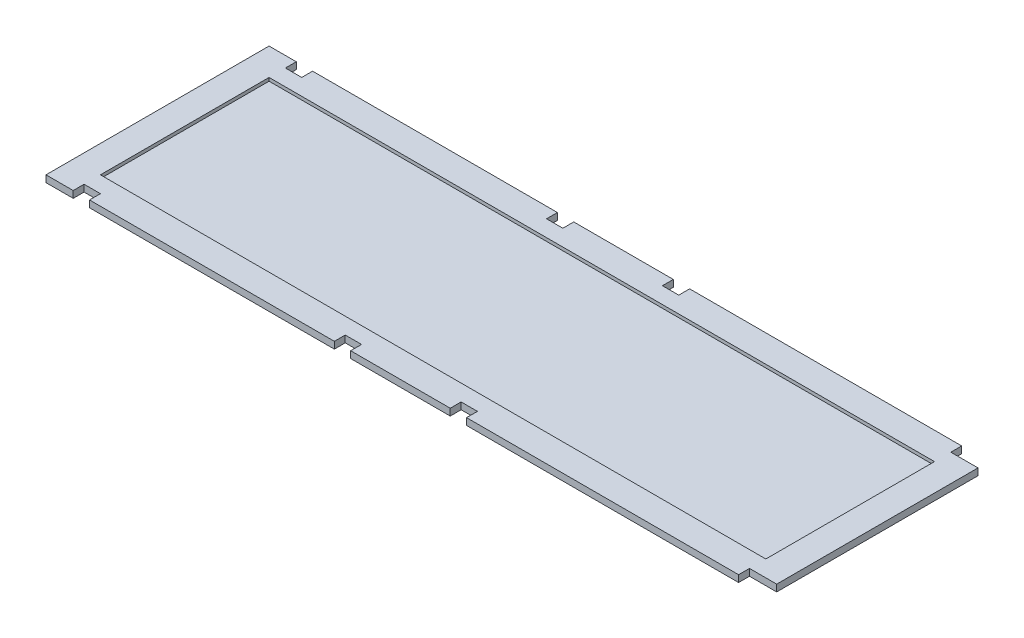
ISO-10303-21;
HEADER;
FILE_DESCRIPTION(('STEP AP214'),'2;1');
FILE_NAME('part.step','',(''),(''),'','','');
FILE_SCHEMA(('AUTOMOTIVE_DESIGN { 1 0 10303 214 1 1 1 1 }'));
ENDSEC;
DATA;
#1=APPLICATION_CONTEXT('core data for automotive mechanical design processes');
#2=APPLICATION_PROTOCOL_DEFINITION('international standard','automotive_design',2000,#1);
#3=PRODUCT_CONTEXT('',#1,'mechanical');
#4=PRODUCT('Part','Part','',(#3));
#5=PRODUCT_RELATED_PRODUCT_CATEGORY('part','',(#4));
#6=PRODUCT_DEFINITION_FORMATION('','',#4);
#7=PRODUCT_DEFINITION_CONTEXT('part definition',#1,'design');
#8=PRODUCT_DEFINITION('design','',#6,#7);
#9=PRODUCT_DEFINITION_SHAPE('','',#8);
#10=(LENGTH_UNIT() NAMED_UNIT(*) SI_UNIT(.MILLI.,.METRE.));
#11=(NAMED_UNIT(*) PLANE_ANGLE_UNIT() SI_UNIT($,.RADIAN.));
#12=(NAMED_UNIT(*) SI_UNIT($,.STERADIAN.) SOLID_ANGLE_UNIT());
#13=UNCERTAINTY_MEASURE_WITH_UNIT(LENGTH_MEASURE(1.E-05),#10,'distance_accuracy_value','');
#14=(GEOMETRIC_REPRESENTATION_CONTEXT(3) GLOBAL_UNCERTAINTY_ASSIGNED_CONTEXT((#13)) GLOBAL_UNIT_ASSIGNED_CONTEXT((#10,
#11,#12)) REPRESENTATION_CONTEXT('',''));
#15=CARTESIAN_POINT('',(0.,0.,0.));
#16=DIRECTION('',(0.,0.,1.));
#17=DIRECTION('',(1.,0.,0.));
#18=AXIS2_PLACEMENT_3D('',#15,#16,#17);
#19=CARTESIAN_POINT('',(0.,1.25,0.));
#20=DIRECTION('',(1.,0.,0.));
#21=DIRECTION('',(0.,0.,-1.));
#22=AXIS2_PLACEMENT_3D('',#19,#20,#21);
#23=PLANE('',#22);
#24=DIRECTION('',(0.,0.,1.));
#25=VECTOR('',#24,1.);
#26=CARTESIAN_POINT('',(0.,0.,0.));
#27=LINE('',#26,#25);
#28=CARTESIAN_POINT('',(0.,0.,-41.));
#29=VERTEX_POINT('',#28);
#30=CARTESIAN_POINT('',(0.,0.,0.));
#31=VERTEX_POINT('',#30);
#32=EDGE_CURVE('E285',#29,#31,#27,.T.);
#33=ORIENTED_EDGE('',*,*,#32,.T.);
#34=DIRECTION('',(0.,-1.,0.));
#35=VECTOR('',#34,1.);
#36=CARTESIAN_POINT('',(0.,1.25,0.));
#37=LINE('',#36,#35);
#38=CARTESIAN_POINT('',(0.,1.25,0.));
#39=VERTEX_POINT('',#38);
#40=EDGE_CURVE('E11',#39,#31,#37,.T.);
#41=ORIENTED_EDGE('',*,*,#40,.F.);
#42=DIRECTION('',(0.,0.,1.));
#43=VECTOR('',#42,1.);
#44=CARTESIAN_POINT('',(0.,1.25,0.));
#45=LINE('',#44,#43);
#46=CARTESIAN_POINT('',(0.,1.25,-41.));
#47=VERTEX_POINT('',#46);
#48=EDGE_CURVE('E349',#47,#39,#45,.T.);
#49=ORIENTED_EDGE('',*,*,#48,.F.);
#50=DIRECTION('',(0.,-1.,0.));
#51=VECTOR('',#50,1.);
#52=CARTESIAN_POINT('',(0.,1.25,-41.));
#53=LINE('',#52,#51);
#54=EDGE_CURVE('E281',#47,#29,#53,.T.);
#55=ORIENTED_EDGE('',*,*,#54,.T.);
#56=EDGE_LOOP('',(#33,#41,#49,#55));
#57=FACE_BOUND('',#56,.T.);
#58=ADVANCED_FACE('F33',(#57),#23,.F.);
#59=CARTESIAN_POINT('',(0.,1.25,0.));
#60=DIRECTION('',(0.,0.,-1.));
#61=DIRECTION('',(-1.,0.,0.));
#62=AXIS2_PLACEMENT_3D('',#59,#60,#61);
#63=PLANE('',#62);
#64=DIRECTION('',(1.,0.,0.));
#65=VECTOR('',#64,1.);
#66=CARTESIAN_POINT('',(0.,0.,0.));
#67=LINE('',#66,#65);
#68=CARTESIAN_POINT('',(5.,0.,0.));
#69=VERTEX_POINT('',#68);
#70=EDGE_CURVE('E288',#31,#69,#67,.T.);
#71=ORIENTED_EDGE('',*,*,#70,.T.);
#72=DIRECTION('',(0.,-1.,0.));
#73=VECTOR('',#72,1.);
#74=CARTESIAN_POINT('',(5.,1.25,0.));
#75=LINE('',#74,#73);
#76=CARTESIAN_POINT('',(5.,1.25,0.));
#77=VERTEX_POINT('',#76);
#78=EDGE_CURVE('E40',#77,#69,#75,.T.);
#79=ORIENTED_EDGE('',*,*,#78,.F.);
#80=DIRECTION('',(1.,0.,0.));
#81=VECTOR('',#80,1.);
#82=CARTESIAN_POINT('',(0.,1.25,0.));
#83=LINE('',#82,#81);
#84=EDGE_CURVE('E169',#39,#77,#83,.T.);
#85=ORIENTED_EDGE('',*,*,#84,.F.);
#86=ORIENTED_EDGE('',*,*,#40,.T.);
#87=EDGE_LOOP('',(#71,#79,#85,#86));
#88=FACE_BOUND('',#87,.T.);
#89=ADVANCED_FACE('F590',(#88),#63,.F.);
#90=CARTESIAN_POINT('',(5.,1.25,0.));
#91=DIRECTION('',(-1.,0.,0.));
#92=DIRECTION('',(0.,0.,1.));
#93=AXIS2_PLACEMENT_3D('',#90,#91,#92);
#94=PLANE('',#93);
#95=DIRECTION('',(0.,0.,-1.));
#96=VECTOR('',#95,1.);
#97=CARTESIAN_POINT('',(5.,0.,0.));
#98=LINE('',#97,#96);
#99=CARTESIAN_POINT('',(5.,0.,-2.));
#100=VERTEX_POINT('',#99);
#101=EDGE_CURVE('E291',#69,#100,#98,.T.);
#102=ORIENTED_EDGE('',*,*,#101,.T.);
#103=DIRECTION('',(0.,-1.,0.));
#104=VECTOR('',#103,1.);
#105=CARTESIAN_POINT('',(5.,1.25,-2.));
#106=LINE('',#105,#104);
#107=CARTESIAN_POINT('',(5.,1.25,-2.));
#108=VERTEX_POINT('',#107);
#109=EDGE_CURVE('E428',#108,#100,#106,.T.);
#110=ORIENTED_EDGE('',*,*,#109,.F.);
#111=DIRECTION('',(0.,0.,-1.));
#112=VECTOR('',#111,1.);
#113=CARTESIAN_POINT('',(5.,1.25,0.));
#114=LINE('',#113,#112);
#115=EDGE_CURVE('E436',#77,#108,#114,.T.);
#116=ORIENTED_EDGE('',*,*,#115,.F.);
#117=ORIENTED_EDGE('',*,*,#78,.T.);
#118=EDGE_LOOP('',(#102,#110,#116,#117));
#119=FACE_BOUND('',#118,.T.);
#120=ADVANCED_FACE('F434',(#119),#94,.F.);
#121=CARTESIAN_POINT('',(5.,1.25,-2.));
#122=DIRECTION('',(0.,0.,-1.));
#123=DIRECTION('',(-1.,0.,0.));
#124=AXIS2_PLACEMENT_3D('',#121,#122,#123);
#125=PLANE('',#124);
#126=DIRECTION('',(1.,0.,0.));
#127=VECTOR('',#126,1.);
#128=CARTESIAN_POINT('',(5.,0.,-2.));
#129=LINE('',#128,#127);
#130=CARTESIAN_POINT('',(8.,0.,-2.));
#131=VERTEX_POINT('',#130);
#132=EDGE_CURVE('E293',#100,#131,#129,.T.);
#133=ORIENTED_EDGE('',*,*,#132,.T.);
#134=DIRECTION('',(0.,-1.,0.));
#135=VECTOR('',#134,1.);
#136=CARTESIAN_POINT('',(8.,1.25,-2.));
#137=LINE('',#136,#135);
#138=CARTESIAN_POINT('',(8.,1.25,-2.));
#139=VERTEX_POINT('',#138);
#140=EDGE_CURVE('E425',#139,#131,#137,.T.);
#141=ORIENTED_EDGE('',*,*,#140,.F.);
#142=DIRECTION('',(1.,0.,0.));
#143=VECTOR('',#142,1.);
#144=CARTESIAN_POINT('',(5.,1.25,-2.));
#145=LINE('',#144,#143);
#146=EDGE_CURVE('E454',#108,#139,#145,.T.);
#147=ORIENTED_EDGE('',*,*,#146,.F.);
#148=ORIENTED_EDGE('',*,*,#109,.T.);
#149=EDGE_LOOP('',(#133,#141,#147,#148));
#150=FACE_BOUND('',#149,.T.);
#151=ADVANCED_FACE('F445',(#150),#125,.F.);
#152=CARTESIAN_POINT('',(8.,1.25,0.));
#153=DIRECTION('',(1.,0.,0.));
#154=DIRECTION('',(0.,0.,-1.));
#155=AXIS2_PLACEMENT_3D('',#152,#153,#154);
#156=PLANE('',#155);
#157=DIRECTION('',(0.,0.,1.));
#158=VECTOR('',#157,1.);
#159=CARTESIAN_POINT('',(8.,0.,0.));
#160=LINE('',#159,#158);
#161=CARTESIAN_POINT('',(8.,0.,0.));
#162=VERTEX_POINT('',#161);
#163=EDGE_CURVE('E295',#131,#162,#160,.T.);
#164=ORIENTED_EDGE('',*,*,#163,.T.);
#165=DIRECTION('',(0.,-1.,0.));
#166=VECTOR('',#165,1.);
#167=CARTESIAN_POINT('',(8.,1.25,0.));
#168=LINE('',#167,#166);
#169=CARTESIAN_POINT('',(8.,1.25,0.));
#170=VERTEX_POINT('',#169);
#171=EDGE_CURVE('E422',#170,#162,#168,.T.);
#172=ORIENTED_EDGE('',*,*,#171,.F.);
#173=DIRECTION('',(0.,0.,1.));
#174=VECTOR('',#173,1.);
#175=CARTESIAN_POINT('',(8.,1.25,0.));
#176=LINE('',#175,#174);
#177=EDGE_CURVE('E451',#139,#170,#176,.T.);
#178=ORIENTED_EDGE('',*,*,#177,.F.);
#179=ORIENTED_EDGE('',*,*,#140,.T.);
#180=EDGE_LOOP('',(#164,#172,#178,#179));
#181=FACE_BOUND('',#180,.T.);
#182=ADVANCED_FACE('F449',(#181),#156,.F.);
#183=CARTESIAN_POINT('',(8.,1.25,0.));
#184=DIRECTION('',(0.,0.,-1.));
#185=DIRECTION('',(-1.,0.,0.));
#186=AXIS2_PLACEMENT_3D('',#183,#184,#185);
#187=PLANE('',#186);
#188=DIRECTION('',(1.,0.,0.));
#189=VECTOR('',#188,1.);
#190=CARTESIAN_POINT('',(8.,0.,0.));
#191=LINE('',#190,#189);
#192=CARTESIAN_POINT('',(53.,0.,0.));
#193=VERTEX_POINT('',#192);
#194=EDGE_CURVE('E297',#162,#193,#191,.T.);
#195=ORIENTED_EDGE('',*,*,#194,.T.);
#196=DIRECTION('',(0.,-1.,0.));
#197=VECTOR('',#196,1.);
#198=CARTESIAN_POINT('',(53.,1.25,0.));
#199=LINE('',#198,#197);
#200=CARTESIAN_POINT('',(53.,1.25,0.));
#201=VERTEX_POINT('',#200);
#202=EDGE_CURVE('E419',#201,#193,#199,.T.);
#203=ORIENTED_EDGE('',*,*,#202,.F.);
#204=DIRECTION('',(1.,0.,0.));
#205=VECTOR('',#204,1.);
#206=CARTESIAN_POINT('',(8.,1.25,0.));
#207=LINE('',#206,#205);
#208=EDGE_CURVE('E453',#170,#201,#207,.T.);
#209=ORIENTED_EDGE('',*,*,#208,.F.);
#210=ORIENTED_EDGE('',*,*,#171,.T.);
#211=EDGE_LOOP('',(#195,#203,#209,#210));
#212=FACE_BOUND('',#211,.T.);
#213=ADVANCED_FACE('F603',(#212),#187,.F.);
#214=CARTESIAN_POINT('',(53.,1.25,0.));
#215=DIRECTION('',(-1.,0.,0.));
#216=DIRECTION('',(0.,0.,1.));
#217=AXIS2_PLACEMENT_3D('',#214,#215,#216);
#218=PLANE('',#217);
#219=DIRECTION('',(0.,0.,-1.));
#220=VECTOR('',#219,1.);
#221=CARTESIAN_POINT('',(53.,0.,0.));
#222=LINE('',#221,#220);
#223=CARTESIAN_POINT('',(53.,0.,-2.));
#224=VERTEX_POINT('',#223);
#225=EDGE_CURVE('E299',#193,#224,#222,.T.);
#226=ORIENTED_EDGE('',*,*,#225,.T.);
#227=DIRECTION('',(0.,-1.,0.));
#228=VECTOR('',#227,1.);
#229=CARTESIAN_POINT('',(53.,1.25,-2.));
#230=LINE('',#229,#228);
#231=CARTESIAN_POINT('',(53.,1.25,-2.));
#232=VERTEX_POINT('',#231);
#233=EDGE_CURVE('E416',#232,#224,#230,.T.);
#234=ORIENTED_EDGE('',*,*,#233,.F.);
#235=DIRECTION('',(0.,0.,-1.));
#236=VECTOR('',#235,1.);
#237=CARTESIAN_POINT('',(53.,1.25,0.));
#238=LINE('',#237,#236);
#239=EDGE_CURVE('E456',#201,#232,#238,.T.);
#240=ORIENTED_EDGE('',*,*,#239,.F.);
#241=ORIENTED_EDGE('',*,*,#202,.T.);
#242=EDGE_LOOP('',(#226,#234,#240,#241));
#243=FACE_BOUND('',#242,.T.);
#244=ADVANCED_FACE('F606',(#243),#218,.F.);
#245=CARTESIAN_POINT('',(53.,1.25,-2.));
#246=DIRECTION('',(0.,0.,-1.));
#247=DIRECTION('',(-1.,0.,0.));
#248=AXIS2_PLACEMENT_3D('',#245,#246,#247);
#249=PLANE('',#248);
#250=DIRECTION('',(1.,0.,0.));
#251=VECTOR('',#250,1.);
#252=CARTESIAN_POINT('',(53.,0.,-2.));
#253=LINE('',#252,#251);
#254=CARTESIAN_POINT('',(56.,0.,-2.));
#255=VERTEX_POINT('',#254);
#256=EDGE_CURVE('E301',#224,#255,#253,.T.);
#257=ORIENTED_EDGE('',*,*,#256,.T.);
#258=DIRECTION('',(0.,-1.,0.));
#259=VECTOR('',#258,1.);
#260=CARTESIAN_POINT('',(56.,1.25,-2.));
#261=LINE('',#260,#259);
#262=CARTESIAN_POINT('',(56.,1.25,-2.));
#263=VERTEX_POINT('',#262);
#264=EDGE_CURVE('E413',#263,#255,#261,.T.);
#265=ORIENTED_EDGE('',*,*,#264,.F.);
#266=DIRECTION('',(1.,0.,0.));
#267=VECTOR('',#266,1.);
#268=CARTESIAN_POINT('',(53.,1.25,-2.));
#269=LINE('',#268,#267);
#270=EDGE_CURVE('E462',#232,#263,#269,.T.);
#271=ORIENTED_EDGE('',*,*,#270,.F.);
#272=ORIENTED_EDGE('',*,*,#233,.T.);
#273=EDGE_LOOP('',(#257,#265,#271,#272));
#274=FACE_BOUND('',#273,.T.);
#275=ADVANCED_FACE('F610',(#274),#249,.F.);
#276=CARTESIAN_POINT('',(56.,1.25,0.));
#277=DIRECTION('',(1.,0.,0.));
#278=DIRECTION('',(0.,0.,-1.));
#279=AXIS2_PLACEMENT_3D('',#276,#277,#278);
#280=PLANE('',#279);
#281=DIRECTION('',(0.,0.,1.));
#282=VECTOR('',#281,1.);
#283=CARTESIAN_POINT('',(56.,0.,0.));
#284=LINE('',#283,#282);
#285=CARTESIAN_POINT('',(56.,0.,0.));
#286=VERTEX_POINT('',#285);
#287=EDGE_CURVE('E303',#255,#286,#284,.T.);
#288=ORIENTED_EDGE('',*,*,#287,.T.);
#289=DIRECTION('',(0.,-1.,0.));
#290=VECTOR('',#289,1.);
#291=CARTESIAN_POINT('',(56.,1.25,0.));
#292=LINE('',#291,#290);
#293=CARTESIAN_POINT('',(56.,1.25,0.));
#294=VERTEX_POINT('',#293);
#295=EDGE_CURVE('E410',#294,#286,#292,.T.);
#296=ORIENTED_EDGE('',*,*,#295,.F.);
#297=DIRECTION('',(0.,0.,1.));
#298=VECTOR('',#297,1.);
#299=CARTESIAN_POINT('',(56.,1.25,0.));
#300=LINE('',#299,#298);
#301=EDGE_CURVE('E464',#263,#294,#300,.T.);
#302=ORIENTED_EDGE('',*,*,#301,.F.);
#303=ORIENTED_EDGE('',*,*,#264,.T.);
#304=EDGE_LOOP('',(#288,#296,#302,#303));
#305=FACE_BOUND('',#304,.T.);
#306=ADVANCED_FACE('F614',(#305),#280,.F.);
#307=CARTESIAN_POINT('',(56.,1.25,0.));
#308=DIRECTION('',(0.,0.,-1.));
#309=DIRECTION('',(-1.,0.,0.));
#310=AXIS2_PLACEMENT_3D('',#307,#308,#309);
#311=PLANE('',#310);
#312=DIRECTION('',(1.,0.,0.));
#313=VECTOR('',#312,1.);
#314=CARTESIAN_POINT('',(56.,0.,0.));
#315=LINE('',#314,#313);
#316=CARTESIAN_POINT('',(74.3,0.,0.));
#317=VERTEX_POINT('',#316);
#318=EDGE_CURVE('E305',#286,#317,#315,.T.);
#319=ORIENTED_EDGE('',*,*,#318,.T.);
#320=DIRECTION('',(0.,-1.,0.));
#321=VECTOR('',#320,1.);
#322=CARTESIAN_POINT('',(74.3,1.25,0.));
#323=LINE('',#322,#321);
#324=CARTESIAN_POINT('',(74.3,1.25,0.));
#325=VERTEX_POINT('',#324);
#326=EDGE_CURVE('E407',#325,#317,#323,.T.);
#327=ORIENTED_EDGE('',*,*,#326,.F.);
#328=DIRECTION('',(1.,0.,0.));
#329=VECTOR('',#328,1.);
#330=CARTESIAN_POINT('',(56.,1.25,0.));
#331=LINE('',#330,#329);
#332=EDGE_CURVE('E466',#294,#325,#331,.T.);
#333=ORIENTED_EDGE('',*,*,#332,.F.);
#334=ORIENTED_EDGE('',*,*,#295,.T.);
#335=EDGE_LOOP('',(#319,#327,#333,#334));
#336=FACE_BOUND('',#335,.T.);
#337=ADVANCED_FACE('F618',(#336),#311,.F.);
#338=CARTESIAN_POINT('',(74.3,1.25,0.));
#339=DIRECTION('',(-1.,0.,0.));
#340=DIRECTION('',(0.,0.,1.));
#341=AXIS2_PLACEMENT_3D('',#338,#339,#340);
#342=PLANE('',#341);
#343=DIRECTION('',(0.,0.,-1.));
#344=VECTOR('',#343,1.);
#345=CARTESIAN_POINT('',(74.3,0.,0.));
#346=LINE('',#345,#344);
#347=CARTESIAN_POINT('',(74.3,0.,-2.));
#348=VERTEX_POINT('',#347);
#349=EDGE_CURVE('E307',#317,#348,#346,.T.);
#350=ORIENTED_EDGE('',*,*,#349,.T.);
#351=DIRECTION('',(0.,-1.,0.));
#352=VECTOR('',#351,1.);
#353=CARTESIAN_POINT('',(74.3,1.25,-2.));
#354=LINE('',#353,#352);
#355=CARTESIAN_POINT('',(74.3,1.25,-2.));
#356=VERTEX_POINT('',#355);
#357=EDGE_CURVE('E404',#356,#348,#354,.T.);
#358=ORIENTED_EDGE('',*,*,#357,.F.);
#359=DIRECTION('',(0.,0.,-1.));
#360=VECTOR('',#359,1.);
#361=CARTESIAN_POINT('',(74.3,1.25,0.));
#362=LINE('',#361,#360);
#363=EDGE_CURVE('E468',#325,#356,#362,.T.);
#364=ORIENTED_EDGE('',*,*,#363,.F.);
#365=ORIENTED_EDGE('',*,*,#326,.T.);
#366=EDGE_LOOP('',(#350,#358,#364,#365));
#367=FACE_BOUND('',#366,.T.);
#368=ADVANCED_FACE('F622',(#367),#342,.F.);
#369=CARTESIAN_POINT('',(74.3,1.25,-2.));
#370=DIRECTION('',(0.,0.,-1.));
#371=DIRECTION('',(-1.,0.,0.));
#372=AXIS2_PLACEMENT_3D('',#369,#370,#371);
#373=PLANE('',#372);
#374=DIRECTION('',(1.,0.,0.));
#375=VECTOR('',#374,1.);
#376=CARTESIAN_POINT('',(74.3,0.,-2.));
#377=LINE('',#376,#375);
#378=CARTESIAN_POINT('',(77.3,0.,-2.));
#379=VERTEX_POINT('',#378);
#380=EDGE_CURVE('E309',#348,#379,#377,.T.);
#381=ORIENTED_EDGE('',*,*,#380,.T.);
#382=DIRECTION('',(0.,-1.,0.));
#383=VECTOR('',#382,1.);
#384=CARTESIAN_POINT('',(77.3,1.25,-2.));
#385=LINE('',#384,#383);
#386=CARTESIAN_POINT('',(77.3,1.25,-2.));
#387=VERTEX_POINT('',#386);
#388=EDGE_CURVE('E401',#387,#379,#385,.T.);
#389=ORIENTED_EDGE('',*,*,#388,.F.);
#390=DIRECTION('',(1.,0.,0.));
#391=VECTOR('',#390,1.);
#392=CARTESIAN_POINT('',(74.3,1.25,-2.));
#393=LINE('',#392,#391);
#394=EDGE_CURVE('E470',#356,#387,#393,.T.);
#395=ORIENTED_EDGE('',*,*,#394,.F.);
#396=ORIENTED_EDGE('',*,*,#357,.T.);
#397=EDGE_LOOP('',(#381,#389,#395,#396));
#398=FACE_BOUND('',#397,.T.);
#399=ADVANCED_FACE('F626',(#398),#373,.F.);
#400=CARTESIAN_POINT('',(77.3,1.25,0.));
#401=DIRECTION('',(1.,0.,0.));
#402=DIRECTION('',(0.,0.,-1.));
#403=AXIS2_PLACEMENT_3D('',#400,#401,#402);
#404=PLANE('',#403);
#405=DIRECTION('',(0.,0.,1.));
#406=VECTOR('',#405,1.);
#407=CARTESIAN_POINT('',(77.3,0.,0.));
#408=LINE('',#407,#406);
#409=CARTESIAN_POINT('',(77.3,0.,0.));
#410=VERTEX_POINT('',#409);
#411=EDGE_CURVE('E311',#379,#410,#408,.T.);
#412=ORIENTED_EDGE('',*,*,#411,.T.);
#413=DIRECTION('',(0.,-1.,0.));
#414=VECTOR('',#413,1.);
#415=CARTESIAN_POINT('',(77.3,1.25,0.));
#416=LINE('',#415,#414);
#417=CARTESIAN_POINT('',(77.3,1.25,0.));
#418=VERTEX_POINT('',#417);
#419=EDGE_CURVE('E398',#418,#410,#416,.T.);
#420=ORIENTED_EDGE('',*,*,#419,.F.);
#421=DIRECTION('',(0.,0.,1.));
#422=VECTOR('',#421,1.);
#423=CARTESIAN_POINT('',(77.3,1.25,0.));
#424=LINE('',#423,#422);
#425=EDGE_CURVE('E472',#387,#418,#424,.T.);
#426=ORIENTED_EDGE('',*,*,#425,.F.);
#427=ORIENTED_EDGE('',*,*,#388,.T.);
#428=EDGE_LOOP('',(#412,#420,#426,#427));
#429=FACE_BOUND('',#428,.T.);
#430=ADVANCED_FACE('F630',(#429),#404,.F.);
#431=CARTESIAN_POINT('',(77.3,1.25,0.));
#432=DIRECTION('',(0.,0.,-1.));
#433=DIRECTION('',(-1.,0.,0.));
#434=AXIS2_PLACEMENT_3D('',#431,#432,#433);
#435=PLANE('',#434);
#436=DIRECTION('',(1.,0.,0.));
#437=VECTOR('',#436,1.);
#438=CARTESIAN_POINT('',(77.3,0.,0.));
#439=LINE('',#438,#437);
#440=CARTESIAN_POINT('',(127.3,0.,0.));
#441=VERTEX_POINT('',#440);
#442=EDGE_CURVE('E313',#410,#441,#439,.T.);
#443=ORIENTED_EDGE('',*,*,#442,.T.);
#444=DIRECTION('',(0.,-1.,0.));
#445=VECTOR('',#444,1.);
#446=CARTESIAN_POINT('',(127.3,1.25,0.));
#447=LINE('',#446,#445);
#448=CARTESIAN_POINT('',(127.3,1.25,0.));
#449=VERTEX_POINT('',#448);
#450=EDGE_CURVE('E395',#449,#441,#447,.T.);
#451=ORIENTED_EDGE('',*,*,#450,.F.);
#452=DIRECTION('',(1.,0.,0.));
#453=VECTOR('',#452,1.);
#454=CARTESIAN_POINT('',(77.3,1.25,0.));
#455=LINE('',#454,#453);
#456=EDGE_CURVE('E474',#418,#449,#455,.T.);
#457=ORIENTED_EDGE('',*,*,#456,.F.);
#458=ORIENTED_EDGE('',*,*,#419,.T.);
#459=EDGE_LOOP('',(#443,#451,#457,#458));
#460=FACE_BOUND('',#459,.T.);
#461=ADVANCED_FACE('F634',(#460),#435,.F.);
#462=CARTESIAN_POINT('',(127.3,1.25,0.));
#463=DIRECTION('',(-1.,0.,0.));
#464=DIRECTION('',(0.,0.,1.));
#465=AXIS2_PLACEMENT_3D('',#462,#463,#464);
#466=PLANE('',#465);
#467=DIRECTION('',(0.,0.,-1.));
#468=VECTOR('',#467,1.);
#469=CARTESIAN_POINT('',(127.3,0.,0.));
#470=LINE('',#469,#468);
#471=CARTESIAN_POINT('',(127.3,0.,-2.));
#472=VERTEX_POINT('',#471);
#473=EDGE_CURVE('E315',#441,#472,#470,.T.);
#474=ORIENTED_EDGE('',*,*,#473,.T.);
#475=DIRECTION('',(0.,-1.,0.));
#476=VECTOR('',#475,1.);
#477=CARTESIAN_POINT('',(127.3,1.25,-2.));
#478=LINE('',#477,#476);
#479=CARTESIAN_POINT('',(127.3,1.25,-2.));
#480=VERTEX_POINT('',#479);
#481=EDGE_CURVE('E392',#480,#472,#478,.T.);
#482=ORIENTED_EDGE('',*,*,#481,.F.);
#483=DIRECTION('',(0.,0.,-1.));
#484=VECTOR('',#483,1.);
#485=CARTESIAN_POINT('',(127.3,1.25,0.));
#486=LINE('',#485,#484);
#487=EDGE_CURVE('E476',#449,#480,#486,.T.);
#488=ORIENTED_EDGE('',*,*,#487,.F.);
#489=ORIENTED_EDGE('',*,*,#450,.T.);
#490=EDGE_LOOP('',(#474,#482,#488,#489));
#491=FACE_BOUND('',#490,.T.);
#492=ADVANCED_FACE('F638',(#491),#466,.F.);
#493=CARTESIAN_POINT('',(127.3,1.25,-2.));
#494=DIRECTION('',(0.,0.,-1.));
#495=DIRECTION('',(-1.,0.,0.));
#496=AXIS2_PLACEMENT_3D('',#493,#494,#495);
#497=PLANE('',#496);
#498=DIRECTION('',(1.,0.,0.));
#499=VECTOR('',#498,1.);
#500=CARTESIAN_POINT('',(127.3,0.,-2.));
#501=LINE('',#500,#499);
#502=CARTESIAN_POINT('',(132.3,0.,-2.));
#503=VERTEX_POINT('',#502);
#504=EDGE_CURVE('E317',#472,#503,#501,.T.);
#505=ORIENTED_EDGE('',*,*,#504,.T.);
#506=DIRECTION('',(0.,-1.,0.));
#507=VECTOR('',#506,1.);
#508=CARTESIAN_POINT('',(132.3,1.25,-2.));
#509=LINE('',#508,#507);
#510=CARTESIAN_POINT('',(132.3,1.25,-2.));
#511=VERTEX_POINT('',#510);
#512=EDGE_CURVE('E389',#511,#503,#509,.T.);
#513=ORIENTED_EDGE('',*,*,#512,.F.);
#514=DIRECTION('',(1.,0.,0.));
#515=VECTOR('',#514,1.);
#516=CARTESIAN_POINT('',(127.3,1.25,-2.));
#517=LINE('',#516,#515);
#518=EDGE_CURVE('E478',#480,#511,#517,.T.);
#519=ORIENTED_EDGE('',*,*,#518,.F.);
#520=ORIENTED_EDGE('',*,*,#481,.T.);
#521=EDGE_LOOP('',(#505,#513,#519,#520));
#522=FACE_BOUND('',#521,.T.);
#523=ADVANCED_FACE('F642',(#522),#497,.F.);
#524=CARTESIAN_POINT('',(132.3,1.25,-2.));
#525=DIRECTION('',(-1.,0.,0.));
#526=DIRECTION('',(0.,0.,1.));
#527=AXIS2_PLACEMENT_3D('',#524,#525,#526);
#528=PLANE('',#527);
#529=DIRECTION('',(0.,0.,-1.));
#530=VECTOR('',#529,1.);
#531=CARTESIAN_POINT('',(132.3,0.,-2.));
#532=LINE('',#531,#530);
#533=CARTESIAN_POINT('',(132.3,0.,-39.));
#534=VERTEX_POINT('',#533);
#535=EDGE_CURVE('E319',#503,#534,#532,.T.);
#536=ORIENTED_EDGE('',*,*,#535,.T.);
#537=DIRECTION('',(0.,-1.,0.));
#538=VECTOR('',#537,1.);
#539=CARTESIAN_POINT('',(132.3,1.25,-39.));
#540=LINE('',#539,#538);
#541=CARTESIAN_POINT('',(132.3,1.25,-39.));
#542=VERTEX_POINT('',#541);
#543=EDGE_CURVE('E386',#542,#534,#540,.T.);
#544=ORIENTED_EDGE('',*,*,#543,.F.);
#545=DIRECTION('',(0.,0.,-1.));
#546=VECTOR('',#545,1.);
#547=CARTESIAN_POINT('',(132.3,1.25,-2.));
#548=LINE('',#547,#546);
#549=EDGE_CURVE('E480',#511,#542,#548,.T.);
#550=ORIENTED_EDGE('',*,*,#549,.F.);
#551=ORIENTED_EDGE('',*,*,#512,.T.);
#552=EDGE_LOOP('',(#536,#544,#550,#551));
#553=FACE_BOUND('',#552,.T.);
#554=ADVANCED_FACE('F646',(#553),#528,.F.);
#555=CARTESIAN_POINT('',(127.3,1.25,-39.));
#556=DIRECTION('',(0.,0.,1.));
#557=DIRECTION('',(1.,0.,0.));
#558=AXIS2_PLACEMENT_3D('',#555,#556,#557);
#559=PLANE('',#558);
#560=DIRECTION('',(-1.,0.,0.));
#561=VECTOR('',#560,1.);
#562=CARTESIAN_POINT('',(127.3,0.,-39.));
#563=LINE('',#562,#561);
#564=CARTESIAN_POINT('',(127.3,0.,-39.));
#565=VERTEX_POINT('',#564);
#566=EDGE_CURVE('E321',#534,#565,#563,.T.);
#567=ORIENTED_EDGE('',*,*,#566,.T.);
#568=DIRECTION('',(0.,-1.,0.));
#569=VECTOR('',#568,1.);
#570=CARTESIAN_POINT('',(127.3,1.25,-39.));
#571=LINE('',#570,#569);
#572=CARTESIAN_POINT('',(127.3,1.25,-39.));
#573=VERTEX_POINT('',#572);
#574=EDGE_CURVE('E383',#573,#565,#571,.T.);
#575=ORIENTED_EDGE('',*,*,#574,.F.);
#576=DIRECTION('',(-1.,0.,0.));
#577=VECTOR('',#576,1.);
#578=CARTESIAN_POINT('',(127.3,1.25,-39.));
#579=LINE('',#578,#577);
#580=EDGE_CURVE('E482',#542,#573,#579,.T.);
#581=ORIENTED_EDGE('',*,*,#580,.F.);
#582=ORIENTED_EDGE('',*,*,#543,.T.);
#583=EDGE_LOOP('',(#567,#575,#581,#582));
#584=FACE_BOUND('',#583,.T.);
#585=ADVANCED_FACE('F650',(#584),#559,.F.);
#586=CARTESIAN_POINT('',(127.3,1.25,-41.));
#587=DIRECTION('',(-1.,0.,0.));
#588=DIRECTION('',(0.,0.,1.));
#589=AXIS2_PLACEMENT_3D('',#586,#587,#588);
#590=PLANE('',#589);
#591=DIRECTION('',(0.,0.,-1.));
#592=VECTOR('',#591,1.);
#593=CARTESIAN_POINT('',(127.3,0.,-41.));
#594=LINE('',#593,#592);
#595=CARTESIAN_POINT('',(127.3,0.,-41.));
#596=VERTEX_POINT('',#595);
#597=EDGE_CURVE('E323',#565,#596,#594,.T.);
#598=ORIENTED_EDGE('',*,*,#597,.T.);
#599=DIRECTION('',(0.,-1.,0.));
#600=VECTOR('',#599,1.);
#601=CARTESIAN_POINT('',(127.3,1.25,-41.));
#602=LINE('',#601,#600);
#603=CARTESIAN_POINT('',(127.3,1.25,-41.));
#604=VERTEX_POINT('',#603);
#605=EDGE_CURVE('E380',#604,#596,#602,.T.);
#606=ORIENTED_EDGE('',*,*,#605,.F.);
#607=DIRECTION('',(0.,0.,-1.));
#608=VECTOR('',#607,1.);
#609=CARTESIAN_POINT('',(127.3,1.25,-41.));
#610=LINE('',#609,#608);
#611=EDGE_CURVE('E484',#573,#604,#610,.T.);
#612=ORIENTED_EDGE('',*,*,#611,.F.);
#613=ORIENTED_EDGE('',*,*,#574,.T.);
#614=EDGE_LOOP('',(#598,#606,#612,#613));
#615=FACE_BOUND('',#614,.T.);
#616=ADVANCED_FACE('F654',(#615),#590,.F.);
#617=CARTESIAN_POINT('',(77.3,1.25,-41.));
#618=DIRECTION('',(0.,0.,1.));
#619=DIRECTION('',(1.,0.,0.));
#620=AXIS2_PLACEMENT_3D('',#617,#618,#619);
#621=PLANE('',#620);
#622=DIRECTION('',(-1.,0.,0.));
#623=VECTOR('',#622,1.);
#624=CARTESIAN_POINT('',(77.3,0.,-41.));
#625=LINE('',#624,#623);
#626=CARTESIAN_POINT('',(77.3,0.,-41.));
#627=VERTEX_POINT('',#626);
#628=EDGE_CURVE('E325',#596,#627,#625,.T.);
#629=ORIENTED_EDGE('',*,*,#628,.T.);
#630=DIRECTION('',(0.,-1.,0.));
#631=VECTOR('',#630,1.);
#632=CARTESIAN_POINT('',(77.3,1.25,-41.));
#633=LINE('',#632,#631);
#634=CARTESIAN_POINT('',(77.3,1.25,-41.));
#635=VERTEX_POINT('',#634);
#636=EDGE_CURVE('E377',#635,#627,#633,.T.);
#637=ORIENTED_EDGE('',*,*,#636,.F.);
#638=DIRECTION('',(-1.,0.,0.));
#639=VECTOR('',#638,1.);
#640=CARTESIAN_POINT('',(77.3,1.25,-41.));
#641=LINE('',#640,#639);
#642=EDGE_CURVE('E486',#604,#635,#641,.T.);
#643=ORIENTED_EDGE('',*,*,#642,.F.);
#644=ORIENTED_EDGE('',*,*,#605,.T.);
#645=EDGE_LOOP('',(#629,#637,#643,#644));
#646=FACE_BOUND('',#645,.T.);
#647=ADVANCED_FACE('F658',(#646),#621,.F.);
#648=CARTESIAN_POINT('',(77.3,1.25,-41.));
#649=DIRECTION('',(1.,0.,0.));
#650=DIRECTION('',(0.,0.,-1.));
#651=AXIS2_PLACEMENT_3D('',#648,#649,#650);
#652=PLANE('',#651);
#653=DIRECTION('',(0.,0.,1.));
#654=VECTOR('',#653,1.);
#655=CARTESIAN_POINT('',(77.3,0.,-41.));
#656=LINE('',#655,#654);
#657=CARTESIAN_POINT('',(77.3,0.,-39.));
#658=VERTEX_POINT('',#657);
#659=EDGE_CURVE('E327',#627,#658,#656,.T.);
#660=ORIENTED_EDGE('',*,*,#659,.T.);
#661=DIRECTION('',(0.,-1.,0.));
#662=VECTOR('',#661,1.);
#663=CARTESIAN_POINT('',(77.3,1.25,-39.));
#664=LINE('',#663,#662);
#665=CARTESIAN_POINT('',(77.3,1.25,-39.));
#666=VERTEX_POINT('',#665);
#667=EDGE_CURVE('E374',#666,#658,#664,.T.);
#668=ORIENTED_EDGE('',*,*,#667,.F.);
#669=DIRECTION('',(0.,0.,1.));
#670=VECTOR('',#669,1.);
#671=CARTESIAN_POINT('',(77.3,1.25,-41.));
#672=LINE('',#671,#670);
#673=EDGE_CURVE('E488',#635,#666,#672,.T.);
#674=ORIENTED_EDGE('',*,*,#673,.F.);
#675=ORIENTED_EDGE('',*,*,#636,.T.);
#676=EDGE_LOOP('',(#660,#668,#674,#675));
#677=FACE_BOUND('',#676,.T.);
#678=ADVANCED_FACE('F662',(#677),#652,.F.);
#679=CARTESIAN_POINT('',(74.3,1.25,-39.));
#680=DIRECTION('',(0.,0.,1.));
#681=DIRECTION('',(1.,0.,0.));
#682=AXIS2_PLACEMENT_3D('',#679,#680,#681);
#683=PLANE('',#682);
#684=DIRECTION('',(-1.,0.,0.));
#685=VECTOR('',#684,1.);
#686=CARTESIAN_POINT('',(74.3,0.,-39.));
#687=LINE('',#686,#685);
#688=CARTESIAN_POINT('',(74.3,0.,-39.));
#689=VERTEX_POINT('',#688);
#690=EDGE_CURVE('E329',#658,#689,#687,.T.);
#691=ORIENTED_EDGE('',*,*,#690,.T.);
#692=DIRECTION('',(0.,-1.,0.));
#693=VECTOR('',#692,1.);
#694=CARTESIAN_POINT('',(74.3,1.25,-39.));
#695=LINE('',#694,#693);
#696=CARTESIAN_POINT('',(74.3,1.25,-39.));
#697=VERTEX_POINT('',#696);
#698=EDGE_CURVE('E371',#697,#689,#695,.T.);
#699=ORIENTED_EDGE('',*,*,#698,.F.);
#700=DIRECTION('',(-1.,0.,0.));
#701=VECTOR('',#700,1.);
#702=CARTESIAN_POINT('',(74.3,1.25,-39.));
#703=LINE('',#702,#701);
#704=EDGE_CURVE('E490',#666,#697,#703,.T.);
#705=ORIENTED_EDGE('',*,*,#704,.F.);
#706=ORIENTED_EDGE('',*,*,#667,.T.);
#707=EDGE_LOOP('',(#691,#699,#705,#706));
#708=FACE_BOUND('',#707,.T.);
#709=ADVANCED_FACE('F666',(#708),#683,.F.);
#710=CARTESIAN_POINT('',(74.3,1.25,-41.));
#711=DIRECTION('',(-1.,0.,0.));
#712=DIRECTION('',(0.,0.,1.));
#713=AXIS2_PLACEMENT_3D('',#710,#711,#712);
#714=PLANE('',#713);
#715=DIRECTION('',(0.,0.,-1.));
#716=VECTOR('',#715,1.);
#717=CARTESIAN_POINT('',(74.3,0.,-41.));
#718=LINE('',#717,#716);
#719=CARTESIAN_POINT('',(74.3,0.,-41.));
#720=VERTEX_POINT('',#719);
#721=EDGE_CURVE('E331',#689,#720,#718,.T.);
#722=ORIENTED_EDGE('',*,*,#721,.T.);
#723=DIRECTION('',(0.,-1.,0.));
#724=VECTOR('',#723,1.);
#725=CARTESIAN_POINT('',(74.3,1.25,-41.));
#726=LINE('',#725,#724);
#727=CARTESIAN_POINT('',(74.3,1.25,-41.));
#728=VERTEX_POINT('',#727);
#729=EDGE_CURVE('E368',#728,#720,#726,.T.);
#730=ORIENTED_EDGE('',*,*,#729,.F.);
#731=DIRECTION('',(0.,0.,-1.));
#732=VECTOR('',#731,1.);
#733=CARTESIAN_POINT('',(74.3,1.25,-41.));
#734=LINE('',#733,#732);
#735=EDGE_CURVE('E492',#697,#728,#734,.T.);
#736=ORIENTED_EDGE('',*,*,#735,.F.);
#737=ORIENTED_EDGE('',*,*,#698,.T.);
#738=EDGE_LOOP('',(#722,#730,#736,#737));
#739=FACE_BOUND('',#738,.T.);
#740=ADVANCED_FACE('F670',(#739),#714,.F.);
#741=CARTESIAN_POINT('',(56.,1.25,-41.));
#742=DIRECTION('',(0.,0.,1.));
#743=DIRECTION('',(1.,0.,0.));
#744=AXIS2_PLACEMENT_3D('',#741,#742,#743);
#745=PLANE('',#744);
#746=DIRECTION('',(-1.,0.,0.));
#747=VECTOR('',#746,1.);
#748=CARTESIAN_POINT('',(56.,0.,-41.));
#749=LINE('',#748,#747);
#750=CARTESIAN_POINT('',(56.,0.,-41.));
#751=VERTEX_POINT('',#750);
#752=EDGE_CURVE('E333',#720,#751,#749,.T.);
#753=ORIENTED_EDGE('',*,*,#752,.T.);
#754=DIRECTION('',(0.,-1.,0.));
#755=VECTOR('',#754,1.);
#756=CARTESIAN_POINT('',(56.,1.25,-41.));
#757=LINE('',#756,#755);
#758=CARTESIAN_POINT('',(56.,1.25,-41.));
#759=VERTEX_POINT('',#758);
#760=EDGE_CURVE('E365',#759,#751,#757,.T.);
#761=ORIENTED_EDGE('',*,*,#760,.F.);
#762=DIRECTION('',(-1.,0.,0.));
#763=VECTOR('',#762,1.);
#764=CARTESIAN_POINT('',(56.,1.25,-41.));
#765=LINE('',#764,#763);
#766=EDGE_CURVE('E494',#728,#759,#765,.T.);
#767=ORIENTED_EDGE('',*,*,#766,.F.);
#768=ORIENTED_EDGE('',*,*,#729,.T.);
#769=EDGE_LOOP('',(#753,#761,#767,#768));
#770=FACE_BOUND('',#769,.T.);
#771=ADVANCED_FACE('F674',(#770),#745,.F.);
#772=CARTESIAN_POINT('',(56.,1.25,-41.));
#773=DIRECTION('',(1.,0.,0.));
#774=DIRECTION('',(0.,0.,-1.));
#775=AXIS2_PLACEMENT_3D('',#772,#773,#774);
#776=PLANE('',#775);
#777=DIRECTION('',(0.,0.,1.));
#778=VECTOR('',#777,1.);
#779=CARTESIAN_POINT('',(56.,0.,-41.));
#780=LINE('',#779,#778);
#781=CARTESIAN_POINT('',(56.,0.,-39.));
#782=VERTEX_POINT('',#781);
#783=EDGE_CURVE('E335',#751,#782,#780,.T.);
#784=ORIENTED_EDGE('',*,*,#783,.T.);
#785=DIRECTION('',(0.,-1.,0.));
#786=VECTOR('',#785,1.);
#787=CARTESIAN_POINT('',(56.,1.25,-39.));
#788=LINE('',#787,#786);
#789=CARTESIAN_POINT('',(56.,1.25,-39.));
#790=VERTEX_POINT('',#789);
#791=EDGE_CURVE('E362',#790,#782,#788,.T.);
#792=ORIENTED_EDGE('',*,*,#791,.F.);
#793=DIRECTION('',(0.,0.,1.));
#794=VECTOR('',#793,1.);
#795=CARTESIAN_POINT('',(56.,1.25,-41.));
#796=LINE('',#795,#794);
#797=EDGE_CURVE('E496',#759,#790,#796,.T.);
#798=ORIENTED_EDGE('',*,*,#797,.F.);
#799=ORIENTED_EDGE('',*,*,#760,.T.);
#800=EDGE_LOOP('',(#784,#792,#798,#799));
#801=FACE_BOUND('',#800,.T.);
#802=ADVANCED_FACE('F678',(#801),#776,.F.);
#803=CARTESIAN_POINT('',(53.,1.25,-39.));
#804=DIRECTION('',(0.,0.,1.));
#805=DIRECTION('',(1.,0.,0.));
#806=AXIS2_PLACEMENT_3D('',#803,#804,#805);
#807=PLANE('',#806);
#808=DIRECTION('',(-1.,0.,0.));
#809=VECTOR('',#808,1.);
#810=CARTESIAN_POINT('',(53.,0.,-39.));
#811=LINE('',#810,#809);
#812=CARTESIAN_POINT('',(53.,0.,-39.));
#813=VERTEX_POINT('',#812);
#814=EDGE_CURVE('E337',#782,#813,#811,.T.);
#815=ORIENTED_EDGE('',*,*,#814,.T.);
#816=DIRECTION('',(0.,-1.,0.));
#817=VECTOR('',#816,1.);
#818=CARTESIAN_POINT('',(53.,1.25,-39.));
#819=LINE('',#818,#817);
#820=CARTESIAN_POINT('',(53.,1.25,-39.));
#821=VERTEX_POINT('',#820);
#822=EDGE_CURVE('E359',#821,#813,#819,.T.);
#823=ORIENTED_EDGE('',*,*,#822,.F.);
#824=DIRECTION('',(-1.,0.,0.));
#825=VECTOR('',#824,1.);
#826=CARTESIAN_POINT('',(53.,1.25,-39.));
#827=LINE('',#826,#825);
#828=EDGE_CURVE('E498',#790,#821,#827,.T.);
#829=ORIENTED_EDGE('',*,*,#828,.F.);
#830=ORIENTED_EDGE('',*,*,#791,.T.);
#831=EDGE_LOOP('',(#815,#823,#829,#830));
#832=FACE_BOUND('',#831,.T.);
#833=ADVANCED_FACE('F682',(#832),#807,.F.);
#834=CARTESIAN_POINT('',(53.,1.25,-41.));
#835=DIRECTION('',(-1.,0.,0.));
#836=DIRECTION('',(0.,0.,1.));
#837=AXIS2_PLACEMENT_3D('',#834,#835,#836);
#838=PLANE('',#837);
#839=DIRECTION('',(0.,0.,-1.));
#840=VECTOR('',#839,1.);
#841=CARTESIAN_POINT('',(53.,0.,-41.));
#842=LINE('',#841,#840);
#843=CARTESIAN_POINT('',(53.,0.,-41.));
#844=VERTEX_POINT('',#843);
#845=EDGE_CURVE('E339',#813,#844,#842,.T.);
#846=ORIENTED_EDGE('',*,*,#845,.T.);
#847=DIRECTION('',(0.,-1.,0.));
#848=VECTOR('',#847,1.);
#849=CARTESIAN_POINT('',(53.,1.25,-41.));
#850=LINE('',#849,#848);
#851=CARTESIAN_POINT('',(53.,1.25,-41.));
#852=VERTEX_POINT('',#851);
#853=EDGE_CURVE('E356',#852,#844,#850,.T.);
#854=ORIENTED_EDGE('',*,*,#853,.F.);
#855=DIRECTION('',(0.,0.,-1.));
#856=VECTOR('',#855,1.);
#857=CARTESIAN_POINT('',(53.,1.25,-41.));
#858=LINE('',#857,#856);
#859=EDGE_CURVE('E500',#821,#852,#858,.T.);
#860=ORIENTED_EDGE('',*,*,#859,.F.);
#861=ORIENTED_EDGE('',*,*,#822,.T.);
#862=EDGE_LOOP('',(#846,#854,#860,#861));
#863=FACE_BOUND('',#862,.T.);
#864=ADVANCED_FACE('F686',(#863),#838,.F.);
#865=CARTESIAN_POINT('',(8.,1.25,-41.));
#866=DIRECTION('',(0.,0.,1.));
#867=DIRECTION('',(1.,0.,0.));
#868=AXIS2_PLACEMENT_3D('',#865,#866,#867);
#869=PLANE('',#868);
#870=DIRECTION('',(-1.,0.,0.));
#871=VECTOR('',#870,1.);
#872=CARTESIAN_POINT('',(8.,0.,-41.));
#873=LINE('',#872,#871);
#874=CARTESIAN_POINT('',(8.,0.,-41.));
#875=VERTEX_POINT('',#874);
#876=EDGE_CURVE('E341',#844,#875,#873,.T.);
#877=ORIENTED_EDGE('',*,*,#876,.T.);
#878=DIRECTION('',(0.,-1.,0.));
#879=VECTOR('',#878,1.);
#880=CARTESIAN_POINT('',(8.,1.25,-41.));
#881=LINE('',#880,#879);
#882=CARTESIAN_POINT('',(8.,1.25,-41.));
#883=VERTEX_POINT('',#882);
#884=EDGE_CURVE('E353',#883,#875,#881,.T.);
#885=ORIENTED_EDGE('',*,*,#884,.F.);
#886=DIRECTION('',(-1.,0.,0.));
#887=VECTOR('',#886,1.);
#888=CARTESIAN_POINT('',(8.,1.25,-41.));
#889=LINE('',#888,#887);
#890=EDGE_CURVE('E502',#852,#883,#889,.T.);
#891=ORIENTED_EDGE('',*,*,#890,.F.);
#892=ORIENTED_EDGE('',*,*,#853,.T.);
#893=EDGE_LOOP('',(#877,#885,#891,#892));
#894=FACE_BOUND('',#893,.T.);
#895=ADVANCED_FACE('F508',(#894),#869,.F.);
#896=CARTESIAN_POINT('',(8.,1.25,-41.));
#897=DIRECTION('',(1.,0.,0.));
#898=DIRECTION('',(0.,0.,-1.));
#899=AXIS2_PLACEMENT_3D('',#896,#897,#898);
#900=PLANE('',#899);
#901=DIRECTION('',(0.,0.,1.));
#902=VECTOR('',#901,1.);
#903=CARTESIAN_POINT('',(8.,0.,-41.));
#904=LINE('',#903,#902);
#905=CARTESIAN_POINT('',(8.,0.,-39.));
#906=VERTEX_POINT('',#905);
#907=EDGE_CURVE('E343',#875,#906,#904,.T.);
#908=ORIENTED_EDGE('',*,*,#907,.T.);
#909=DIRECTION('',(0.,-1.,0.));
#910=VECTOR('',#909,1.);
#911=CARTESIAN_POINT('',(8.,1.25,-39.));
#912=LINE('',#911,#910);
#913=CARTESIAN_POINT('',(8.,1.25,-39.));
#914=VERTEX_POINT('',#913);
#915=EDGE_CURVE('E276',#914,#906,#912,.T.);
#916=ORIENTED_EDGE('',*,*,#915,.F.);
#917=DIRECTION('',(0.,0.,1.));
#918=VECTOR('',#917,1.);
#919=CARTESIAN_POINT('',(8.,1.25,-41.));
#920=LINE('',#919,#918);
#921=EDGE_CURVE('E264',#883,#914,#920,.T.);
#922=ORIENTED_EDGE('',*,*,#921,.F.);
#923=ORIENTED_EDGE('',*,*,#884,.T.);
#924=EDGE_LOOP('',(#908,#916,#922,#923));
#925=FACE_BOUND('',#924,.T.);
#926=ADVANCED_FACE('F512',(#925),#900,.F.);
#927=CARTESIAN_POINT('',(5.,1.25,-39.));
#928=DIRECTION('',(0.,0.,1.));
#929=DIRECTION('',(1.,0.,0.));
#930=AXIS2_PLACEMENT_3D('',#927,#928,#929);
#931=PLANE('',#930);
#932=DIRECTION('',(-1.,0.,0.));
#933=VECTOR('',#932,1.);
#934=CARTESIAN_POINT('',(5.,0.,-39.));
#935=LINE('',#934,#933);
#936=CARTESIAN_POINT('',(5.,0.,-39.));
#937=VERTEX_POINT('',#936);
#938=EDGE_CURVE('E273',#906,#937,#935,.T.);
#939=ORIENTED_EDGE('',*,*,#938,.T.);
#940=DIRECTION('',(0.,-1.,0.));
#941=VECTOR('',#940,1.);
#942=CARTESIAN_POINT('',(5.,1.25,-39.));
#943=LINE('',#942,#941);
#944=CARTESIAN_POINT('',(5.,1.25,-39.));
#945=VERTEX_POINT('',#944);
#946=EDGE_CURVE('E270',#945,#937,#943,.T.);
#947=ORIENTED_EDGE('',*,*,#946,.F.);
#948=DIRECTION('',(-1.,0.,0.));
#949=VECTOR('',#948,1.);
#950=CARTESIAN_POINT('',(5.,1.25,-39.));
#951=LINE('',#950,#949);
#952=EDGE_CURVE('E257',#914,#945,#951,.T.);
#953=ORIENTED_EDGE('',*,*,#952,.F.);
#954=ORIENTED_EDGE('',*,*,#915,.T.);
#955=EDGE_LOOP('',(#939,#947,#953,#954));
#956=FACE_BOUND('',#955,.T.);
#957=ADVANCED_FACE('F271',(#956),#931,.F.);
#958=CARTESIAN_POINT('',(5.,1.25,-41.));
#959=DIRECTION('',(-1.,0.,0.));
#960=DIRECTION('',(0.,0.,1.));
#961=AXIS2_PLACEMENT_3D('',#958,#959,#960);
#962=PLANE('',#961);
#963=DIRECTION('',(0.,0.,-1.));
#964=VECTOR('',#963,1.);
#965=CARTESIAN_POINT('',(5.,0.,-41.));
#966=LINE('',#965,#964);
#967=CARTESIAN_POINT('',(5.,0.,-41.));
#968=VERTEX_POINT('',#967);
#969=EDGE_CURVE('E346',#937,#968,#966,.T.);
#970=ORIENTED_EDGE('',*,*,#969,.T.);
#971=DIRECTION('',(0.,-1.,0.));
#972=VECTOR('',#971,1.);
#973=CARTESIAN_POINT('',(5.,1.25,-41.));
#974=LINE('',#973,#972);
#975=CARTESIAN_POINT('',(5.,1.25,-41.));
#976=VERTEX_POINT('',#975);
#977=EDGE_CURVE('E277',#976,#968,#974,.T.);
#978=ORIENTED_EDGE('',*,*,#977,.F.);
#979=DIRECTION('',(0.,0.,-1.));
#980=VECTOR('',#979,1.);
#981=CARTESIAN_POINT('',(5.,1.25,-41.));
#982=LINE('',#981,#980);
#983=EDGE_CURVE('E261',#945,#976,#982,.T.);
#984=ORIENTED_EDGE('',*,*,#983,.F.);
#985=ORIENTED_EDGE('',*,*,#946,.T.);
#986=EDGE_LOOP('',(#970,#978,#984,#985));
#987=FACE_BOUND('',#986,.T.);
#988=ADVANCED_FACE('F279',(#987),#962,.F.);
#989=CARTESIAN_POINT('',(0.,1.25,-41.));
#990=DIRECTION('',(0.,0.,1.));
#991=DIRECTION('',(1.,0.,0.));
#992=AXIS2_PLACEMENT_3D('',#989,#990,#991);
#993=PLANE('',#992);
#994=DIRECTION('',(-1.,0.,0.));
#995=VECTOR('',#994,1.);
#996=CARTESIAN_POINT('',(0.,0.,-41.));
#997=LINE('',#996,#995);
#998=EDGE_CURVE('E161',#968,#29,#997,.T.);
#999=ORIENTED_EDGE('',*,*,#998,.T.);
#1000=ORIENTED_EDGE('',*,*,#54,.F.);
#1001=DIRECTION('',(-1.,0.,0.));
#1002=VECTOR('',#1001,1.);
#1003=CARTESIAN_POINT('',(0.,1.25,-41.));
#1004=LINE('',#1003,#1002);
#1005=EDGE_CURVE('E56',#976,#47,#1004,.T.);
#1006=ORIENTED_EDGE('',*,*,#1005,.F.);
#1007=ORIENTED_EDGE('',*,*,#977,.T.);
#1008=EDGE_LOOP('',(#999,#1000,#1006,#1007));
#1009=FACE_BOUND('',#1008,.T.);
#1010=ADVANCED_FACE('F513',(#1009),#993,.F.);
#1011=CARTESIAN_POINT('',(0.,1.25,0.));
#1012=DIRECTION('',(0.,-1.,0.));
#1013=DIRECTION('',(0.,0.,-1.));
#1014=AXIS2_PLACEMENT_3D('',#1011,#1012,#1013);
#1015=PLANE('',#1014);
#1016=DIRECTION('',(1.,0.,0.));
#1017=VECTOR('',#1016,1.);
#1018=CARTESIAN_POINT('',(5.,1.25,-5.));
#1019=LINE('',#1018,#1017);
#1020=CARTESIAN_POINT('',(5.,1.25,-5.));
#1021=VERTEX_POINT('',#1020);
#1022=CARTESIAN_POINT('',(127.3,1.25,-5.));
#1023=VERTEX_POINT('',#1022);
#1024=EDGE_CURVE('E537',#1021,#1023,#1019,.T.);
#1025=ORIENTED_EDGE('',*,*,#1024,.F.);
#1026=DIRECTION('',(0.,0.,1.));
#1027=VECTOR('',#1026,1.);
#1028=CARTESIAN_POINT('',(5.,1.25,-36.));
#1029=LINE('',#1028,#1027);
#1030=CARTESIAN_POINT('',(5.,1.25,-36.));
#1031=VERTEX_POINT('',#1030);
#1032=EDGE_CURVE('E47',#1031,#1021,#1029,.T.);
#1033=ORIENTED_EDGE('',*,*,#1032,.F.);
#1034=DIRECTION('',(-1.,0.,0.));
#1035=VECTOR('',#1034,1.);
#1036=CARTESIAN_POINT('',(5.,1.25,-36.));
#1037=LINE('',#1036,#1035);
#1038=CARTESIAN_POINT('',(127.3,1.25,-36.));
#1039=VERTEX_POINT('',#1038);
#1040=EDGE_CURVE('E530',#1039,#1031,#1037,.T.);
#1041=ORIENTED_EDGE('',*,*,#1040,.F.);
#1042=DIRECTION('',(0.,0.,-1.));
#1043=VECTOR('',#1042,1.);
#1044=CARTESIAN_POINT('',(127.3,1.25,-36.));
#1045=LINE('',#1044,#1043);
#1046=EDGE_CURVE('E534',#1023,#1039,#1045,.T.);
#1047=ORIENTED_EDGE('',*,*,#1046,.F.);
#1048=EDGE_LOOP('',(#1025,#1033,#1041,#1047));
#1049=FACE_BOUND('',#1048,.T.);
#1050=ORIENTED_EDGE('',*,*,#48,.T.);
#1051=ORIENTED_EDGE('',*,*,#84,.T.);
#1052=ORIENTED_EDGE('',*,*,#115,.T.);
#1053=ORIENTED_EDGE('',*,*,#146,.T.);
#1054=ORIENTED_EDGE('',*,*,#177,.T.);
#1055=ORIENTED_EDGE('',*,*,#208,.T.);
#1056=ORIENTED_EDGE('',*,*,#239,.T.);
#1057=ORIENTED_EDGE('',*,*,#270,.T.);
#1058=ORIENTED_EDGE('',*,*,#301,.T.);
#1059=ORIENTED_EDGE('',*,*,#332,.T.);
#1060=ORIENTED_EDGE('',*,*,#363,.T.);
#1061=ORIENTED_EDGE('',*,*,#394,.T.);
#1062=ORIENTED_EDGE('',*,*,#425,.T.);
#1063=ORIENTED_EDGE('',*,*,#456,.T.);
#1064=ORIENTED_EDGE('',*,*,#487,.T.);
#1065=ORIENTED_EDGE('',*,*,#518,.T.);
#1066=ORIENTED_EDGE('',*,*,#549,.T.);
#1067=ORIENTED_EDGE('',*,*,#580,.T.);
#1068=ORIENTED_EDGE('',*,*,#611,.T.);
#1069=ORIENTED_EDGE('',*,*,#642,.T.);
#1070=ORIENTED_EDGE('',*,*,#673,.T.);
#1071=ORIENTED_EDGE('',*,*,#704,.T.);
#1072=ORIENTED_EDGE('',*,*,#735,.T.);
#1073=ORIENTED_EDGE('',*,*,#766,.T.);
#1074=ORIENTED_EDGE('',*,*,#797,.T.);
#1075=ORIENTED_EDGE('',*,*,#828,.T.);
#1076=ORIENTED_EDGE('',*,*,#859,.T.);
#1077=ORIENTED_EDGE('',*,*,#890,.T.);
#1078=ORIENTED_EDGE('',*,*,#921,.T.);
#1079=ORIENTED_EDGE('',*,*,#952,.T.);
#1080=ORIENTED_EDGE('',*,*,#983,.T.);
#1081=ORIENTED_EDGE('',*,*,#1005,.T.);
#1082=EDGE_LOOP('',(#1050,#1051,#1052,#1053,#1054,#1055,#1056,#1057,#1058,#1059,#1060,#1061,
#1062,#1063,#1064,#1065,#1066,#1067,#1068,#1069,#1070,#1071,#1072,#1073,#1074,#1075,#1076,#1077,
#1078,#1079,#1080,#1081));
#1083=FACE_BOUND('',#1082,.T.);
#1084=ADVANCED_FACE('F259',(#1049,#1083),#1015,.F.);
#1085=CARTESIAN_POINT('',(0.,0.,0.));
#1086=DIRECTION('',(0.,-1.,0.));
#1087=DIRECTION('',(0.,0.,-1.));
#1088=AXIS2_PLACEMENT_3D('',#1085,#1086,#1087);
#1089=PLANE('',#1088);
#1090=ORIENTED_EDGE('',*,*,#32,.F.);
#1091=ORIENTED_EDGE('',*,*,#998,.F.);
#1092=ORIENTED_EDGE('',*,*,#969,.F.);
#1093=ORIENTED_EDGE('',*,*,#938,.F.);
#1094=ORIENTED_EDGE('',*,*,#907,.F.);
#1095=ORIENTED_EDGE('',*,*,#876,.F.);
#1096=ORIENTED_EDGE('',*,*,#845,.F.);
#1097=ORIENTED_EDGE('',*,*,#814,.F.);
#1098=ORIENTED_EDGE('',*,*,#783,.F.);
#1099=ORIENTED_EDGE('',*,*,#752,.F.);
#1100=ORIENTED_EDGE('',*,*,#721,.F.);
#1101=ORIENTED_EDGE('',*,*,#690,.F.);
#1102=ORIENTED_EDGE('',*,*,#659,.F.);
#1103=ORIENTED_EDGE('',*,*,#628,.F.);
#1104=ORIENTED_EDGE('',*,*,#597,.F.);
#1105=ORIENTED_EDGE('',*,*,#566,.F.);
#1106=ORIENTED_EDGE('',*,*,#535,.F.);
#1107=ORIENTED_EDGE('',*,*,#504,.F.);
#1108=ORIENTED_EDGE('',*,*,#473,.F.);
#1109=ORIENTED_EDGE('',*,*,#442,.F.);
#1110=ORIENTED_EDGE('',*,*,#411,.F.);
#1111=ORIENTED_EDGE('',*,*,#380,.F.);
#1112=ORIENTED_EDGE('',*,*,#349,.F.);
#1113=ORIENTED_EDGE('',*,*,#318,.F.);
#1114=ORIENTED_EDGE('',*,*,#287,.F.);
#1115=ORIENTED_EDGE('',*,*,#256,.F.);
#1116=ORIENTED_EDGE('',*,*,#225,.F.);
#1117=ORIENTED_EDGE('',*,*,#194,.F.);
#1118=ORIENTED_EDGE('',*,*,#163,.F.);
#1119=ORIENTED_EDGE('',*,*,#132,.F.);
#1120=ORIENTED_EDGE('',*,*,#101,.F.);
#1121=ORIENTED_EDGE('',*,*,#70,.F.);
#1122=EDGE_LOOP('',(#1090,#1091,#1092,#1093,#1094,#1095,#1096,#1097,#1098,#1099,#1100,#1101,
#1102,#1103,#1104,#1105,#1106,#1107,#1108,#1109,#1110,#1111,#1112,#1113,#1114,#1115,#1116,#1117,
#1118,#1119,#1120,#1121));
#1123=FACE_BOUND('',#1122,.T.);
#1124=ADVANCED_FACE('F440',(#1123),#1089,.T.);
#1125=CARTESIAN_POINT('',(5.,0.65,-36.));
#1126=DIRECTION('',(-1.,0.,0.));
#1127=DIRECTION('',(0.,0.,1.));
#1128=AXIS2_PLACEMENT_3D('',#1125,#1126,#1127);
#1129=PLANE('',#1128);
#1130=ORIENTED_EDGE('',*,*,#1032,.T.);
#1131=DIRECTION('',(0.,1.,0.));
#1132=VECTOR('',#1131,1.);
#1133=CARTESIAN_POINT('',(5.,0.65,-5.));
#1134=LINE('',#1133,#1132);
#1135=CARTESIAN_POINT('',(5.,0.65,-5.));
#1136=VERTEX_POINT('',#1135);
#1137=EDGE_CURVE('E520',#1136,#1021,#1134,.T.);
#1138=ORIENTED_EDGE('',*,*,#1137,.F.);
#1139=DIRECTION('',(0.,0.,1.));
#1140=VECTOR('',#1139,1.);
#1141=CARTESIAN_POINT('',(5.,0.65,-36.));
#1142=LINE('',#1141,#1140);
#1143=CARTESIAN_POINT('',(5.,0.65,-36.));
#1144=VERTEX_POINT('',#1143);
#1145=EDGE_CURVE('E533',#1144,#1136,#1142,.T.);
#1146=ORIENTED_EDGE('',*,*,#1145,.F.);
#1147=DIRECTION('',(0.,1.,0.));
#1148=VECTOR('',#1147,1.);
#1149=CARTESIAN_POINT('',(5.,0.65,-36.));
#1150=LINE('',#1149,#1148);
#1151=EDGE_CURVE('E289',#1144,#1031,#1150,.T.);
#1152=ORIENTED_EDGE('',*,*,#1151,.T.);
#1153=EDGE_LOOP('',(#1130,#1138,#1146,#1152));
#1154=FACE_BOUND('',#1153,.T.);
#1155=ADVANCED_FACE('F558',(#1154),#1129,.F.);
#1156=CARTESIAN_POINT('',(5.,0.65,-36.));
#1157=DIRECTION('',(0.,0.,-1.));
#1158=DIRECTION('',(-1.,0.,0.));
#1159=AXIS2_PLACEMENT_3D('',#1156,#1157,#1158);
#1160=PLANE('',#1159);
#1161=ORIENTED_EDGE('',*,*,#1040,.T.);
#1162=ORIENTED_EDGE('',*,*,#1151,.F.);
#1163=DIRECTION('',(-1.,0.,0.));
#1164=VECTOR('',#1163,1.);
#1165=CARTESIAN_POINT('',(5.,0.65,-36.));
#1166=LINE('',#1165,#1164);
#1167=CARTESIAN_POINT('',(127.3,0.65,-36.));
#1168=VERTEX_POINT('',#1167);
#1169=EDGE_CURVE('E523',#1168,#1144,#1166,.T.);
#1170=ORIENTED_EDGE('',*,*,#1169,.F.);
#1171=DIRECTION('',(0.,1.,0.));
#1172=VECTOR('',#1171,1.);
#1173=CARTESIAN_POINT('',(127.3,0.65,-36.));
#1174=LINE('',#1173,#1172);
#1175=EDGE_CURVE('E526',#1168,#1039,#1174,.T.);
#1176=ORIENTED_EDGE('',*,*,#1175,.T.);
#1177=EDGE_LOOP('',(#1161,#1162,#1170,#1176));
#1178=FACE_BOUND('',#1177,.T.);
#1179=ADVANCED_FACE('F569',(#1178),#1160,.F.);
#1180=CARTESIAN_POINT('',(127.3,0.65,-36.));
#1181=DIRECTION('',(1.,0.,0.));
#1182=DIRECTION('',(0.,0.,-1.));
#1183=AXIS2_PLACEMENT_3D('',#1180,#1181,#1182);
#1184=PLANE('',#1183);
#1185=ORIENTED_EDGE('',*,*,#1046,.T.);
#1186=ORIENTED_EDGE('',*,*,#1175,.F.);
#1187=DIRECTION('',(0.,0.,-1.));
#1188=VECTOR('',#1187,1.);
#1189=CARTESIAN_POINT('',(127.3,0.65,-36.));
#1190=LINE('',#1189,#1188);
#1191=CARTESIAN_POINT('',(127.3,0.65,-5.));
#1192=VERTEX_POINT('',#1191);
#1193=EDGE_CURVE('E543',#1192,#1168,#1190,.T.);
#1194=ORIENTED_EDGE('',*,*,#1193,.F.);
#1195=DIRECTION('',(0.,1.,0.));
#1196=VECTOR('',#1195,1.);
#1197=CARTESIAN_POINT('',(127.3,0.65,-5.));
#1198=LINE('',#1197,#1196);
#1199=EDGE_CURVE('E522',#1192,#1023,#1198,.T.);
#1200=ORIENTED_EDGE('',*,*,#1199,.T.);
#1201=EDGE_LOOP('',(#1185,#1186,#1194,#1200));
#1202=FACE_BOUND('',#1201,.T.);
#1203=ADVANCED_FACE('F574',(#1202),#1184,.F.);
#1204=CARTESIAN_POINT('',(5.,0.65,-5.));
#1205=DIRECTION('',(0.,0.,1.));
#1206=DIRECTION('',(1.,0.,0.));
#1207=AXIS2_PLACEMENT_3D('',#1204,#1205,#1206);
#1208=PLANE('',#1207);
#1209=ORIENTED_EDGE('',*,*,#1024,.T.);
#1210=ORIENTED_EDGE('',*,*,#1199,.F.);
#1211=DIRECTION('',(1.,0.,0.));
#1212=VECTOR('',#1211,1.);
#1213=CARTESIAN_POINT('',(5.,0.65,-5.));
#1214=LINE('',#1213,#1212);
#1215=EDGE_CURVE('E546',#1136,#1192,#1214,.T.);
#1216=ORIENTED_EDGE('',*,*,#1215,.F.);
#1217=ORIENTED_EDGE('',*,*,#1137,.T.);
#1218=EDGE_LOOP('',(#1209,#1210,#1216,#1217));
#1219=FACE_BOUND('',#1218,.T.);
#1220=ADVANCED_FACE('F579',(#1219),#1208,.F.);
#1221=CARTESIAN_POINT('',(0.,0.65,0.));
#1222=DIRECTION('',(0.,1.,0.));
#1223=DIRECTION('',(0.,0.,1.));
#1224=AXIS2_PLACEMENT_3D('',#1221,#1222,#1223);
#1225=PLANE('',#1224);
#1226=ORIENTED_EDGE('',*,*,#1145,.T.);
#1227=ORIENTED_EDGE('',*,*,#1215,.T.);
#1228=ORIENTED_EDGE('',*,*,#1193,.T.);
#1229=ORIENTED_EDGE('',*,*,#1169,.T.);
#1230=EDGE_LOOP('',(#1226,#1227,#1228,#1229));
#1231=FACE_BOUND('',#1230,.T.);
#1232=ADVANCED_FACE('F553',(#1231),#1225,.T.);
#1233=CLOSED_SHELL('',(#58,#89,#120,#151,#182,#213,#244,#275,#306,#337,#368,#399,#430,#461,#492,
#523,#554,#585,#616,#647,#678,#709,#740,#771,#802,#833,#864,#895,#926,#957,#988,#1010,#1084,
#1124,#1155,#1179,#1203,#1220,#1232));
#1234=MANIFOLD_SOLID_BREP('B2',#1233);
#1235=ADVANCED_BREP_SHAPE_REPRESENTATION('',(#18,#1234),#14);
#1236=SHAPE_DEFINITION_REPRESENTATION(#9,#1235);
ENDSEC;
END-ISO-10303-21;
